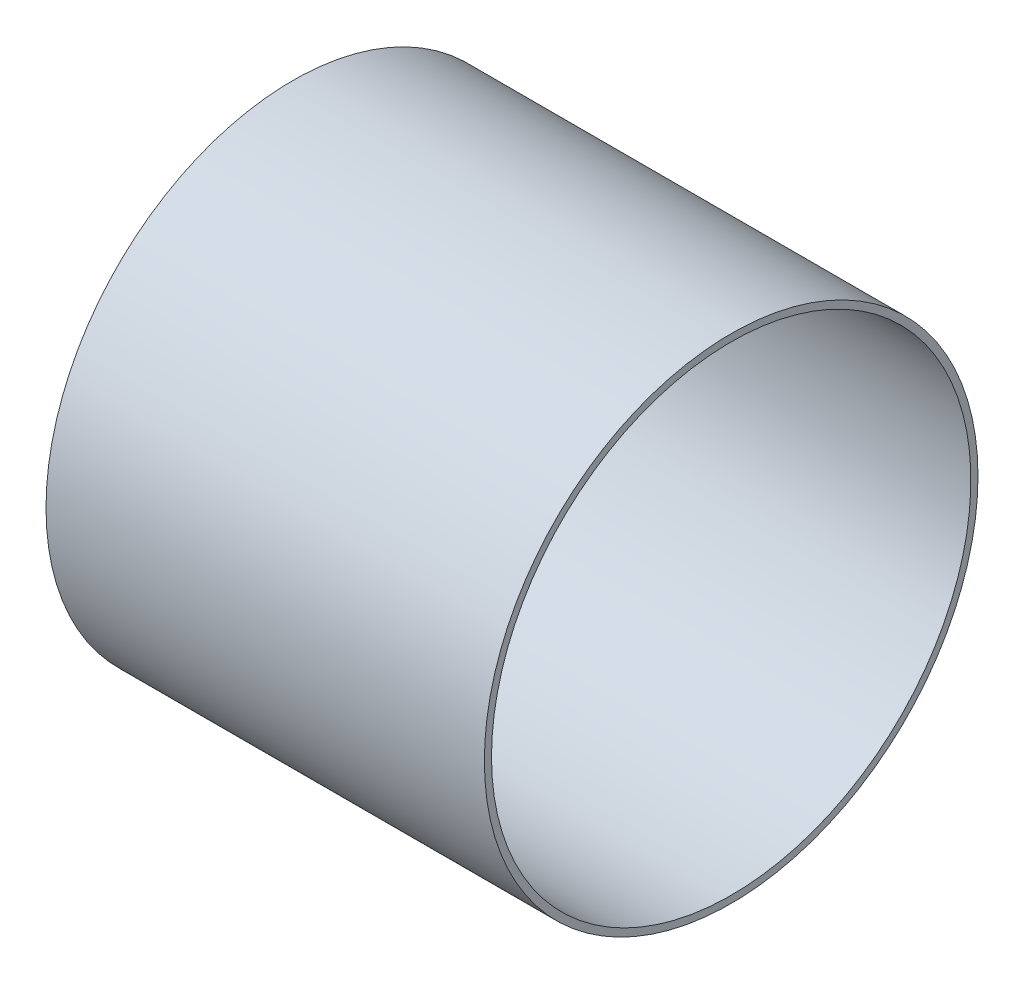
ISO-10303-21;
HEADER;
FILE_DESCRIPTION(('STEP AP214'),'2;1');
FILE_NAME('part.step','',(''),(''),'','','');
FILE_SCHEMA(('AUTOMOTIVE_DESIGN { 1 0 10303 214 1 1 1 1 }'));
ENDSEC;
DATA;
#1=APPLICATION_CONTEXT('core data for automotive mechanical design processes');
#2=APPLICATION_PROTOCOL_DEFINITION('international standard','automotive_design',2000,#1);
#3=PRODUCT_CONTEXT('',#1,'mechanical');
#4=PRODUCT('Part','Part','',(#3));
#5=PRODUCT_RELATED_PRODUCT_CATEGORY('part','',(#4));
#6=PRODUCT_DEFINITION_FORMATION('','',#4);
#7=PRODUCT_DEFINITION_CONTEXT('part definition',#1,'design');
#8=PRODUCT_DEFINITION('design','',#6,#7);
#9=PRODUCT_DEFINITION_SHAPE('','',#8);
#10=(LENGTH_UNIT() NAMED_UNIT(*) SI_UNIT(.MILLI.,.METRE.));
#11=(NAMED_UNIT(*) PLANE_ANGLE_UNIT() SI_UNIT($,.RADIAN.));
#12=(NAMED_UNIT(*) SI_UNIT($,.STERADIAN.) SOLID_ANGLE_UNIT());
#13=UNCERTAINTY_MEASURE_WITH_UNIT(LENGTH_MEASURE(1.E-05),#10,'distance_accuracy_value','');
#14=(GEOMETRIC_REPRESENTATION_CONTEXT(3) GLOBAL_UNCERTAINTY_ASSIGNED_CONTEXT((#13)) GLOBAL_UNIT_ASSIGNED_CONTEXT((#10,
#11,#12)) REPRESENTATION_CONTEXT('',''));
#15=CARTESIAN_POINT('',(0.,0.,0.));
#16=DIRECTION('',(0.,0.,1.));
#17=DIRECTION('',(1.,0.,0.));
#18=AXIS2_PLACEMENT_3D('',#15,#16,#17);
#19=CARTESIAN_POINT('',(101.50094,0.,0.));
#20=DIRECTION('',(1.,0.,0.));
#21=DIRECTION('',(0.,0.,-1.));
#22=AXIS2_PLACEMENT_3D('',#19,#20,#21);
#23=PLANE('',#22);
#24=CARTESIAN_POINT('',(101.50094,0.,0.));
#25=DIRECTION('',(1.,0.,0.));
#26=DIRECTION('',(0.,0.,-1.));
#27=AXIS2_PLACEMENT_3D('',#24,#25,#26);
#28=CIRCLE('',#27,57.15);
#29=CARTESIAN_POINT('',(101.50094,0.,57.15));
#30=VERTEX_POINT('',#29);
#31=EDGE_CURVE('E10',#30,#30,#28,.T.);
#32=ORIENTED_EDGE('',*,*,#31,.T.);
#33=EDGE_LOOP('',(#32));
#34=FACE_BOUND('',#33,.T.);
#35=CARTESIAN_POINT('',(101.50094,0.,0.));
#36=DIRECTION('',(1.,0.,0.));
#37=DIRECTION('',(0.,0.,-1.));
#38=AXIS2_PLACEMENT_3D('',#35,#36,#37);
#39=CIRCLE('',#38,55.499);
#40=CARTESIAN_POINT('',(101.50094,0.,55.499));
#41=VERTEX_POINT('',#40);
#42=EDGE_CURVE('E54',#41,#41,#39,.T.);
#43=ORIENTED_EDGE('',*,*,#42,.F.);
#44=EDGE_LOOP('',(#43));
#45=FACE_BOUND('',#44,.T.);
#46=ADVANCED_FACE('F41',(#34,#45),#23,.T.);
#47=CARTESIAN_POINT('',(0.,0.,0.));
#48=DIRECTION('',(1.,0.,0.));
#49=DIRECTION('',(0.,0.,-1.));
#50=AXIS2_PLACEMENT_3D('',#47,#48,#49);
#51=PLANE('',#50);
#52=CARTESIAN_POINT('',(0.,0.,0.));
#53=DIRECTION('',(1.,0.,0.));
#54=DIRECTION('',(0.,0.,-1.));
#55=AXIS2_PLACEMENT_3D('',#52,#53,#54);
#56=CIRCLE('',#55,57.15);
#57=CARTESIAN_POINT('',(0.,0.,57.15));
#58=VERTEX_POINT('',#57);
#59=EDGE_CURVE('E45',#58,#58,#56,.T.);
#60=ORIENTED_EDGE('',*,*,#59,.F.);
#61=EDGE_LOOP('',(#60));
#62=FACE_BOUND('',#61,.T.);
#63=CARTESIAN_POINT('',(0.,0.,0.));
#64=DIRECTION('',(1.,0.,0.));
#65=DIRECTION('',(0.,0.,-1.));
#66=AXIS2_PLACEMENT_3D('',#63,#64,#65);
#67=CIRCLE('',#66,55.499);
#68=CARTESIAN_POINT('',(0.,0.,55.499));
#69=VERTEX_POINT('',#68);
#70=EDGE_CURVE('E56',#69,#69,#67,.T.);
#71=ORIENTED_EDGE('',*,*,#70,.T.);
#72=EDGE_LOOP('',(#71));
#73=FACE_BOUND('',#72,.T.);
#74=ADVANCED_FACE('F68',(#62,#73),#51,.F.);
#75=CARTESIAN_POINT('',(101.50094,0.,0.));
#76=DIRECTION('',(-1.,0.,0.));
#77=DIRECTION('',(0.,0.,1.));
#78=AXIS2_PLACEMENT_3D('',#75,#76,#77);
#79=CYLINDRICAL_SURFACE('',#78,57.15);
#80=CARTESIAN_POINT('',(101.50094,0.,57.15));
#81=CARTESIAN_POINT('',(100.443638541667,0.,57.15));
#82=CARTESIAN_POINT('',(99.3863370833333,0.,57.15));
#83=CARTESIAN_POINT('',(97.2717341666667,0.,57.15));
#84=CARTESIAN_POINT('',(96.2144327083333,0.,57.15));
#85=CARTESIAN_POINT('',(94.0998297916667,0.,57.15));
#86=CARTESIAN_POINT('',(93.0425283333333,0.,57.15));
#87=CARTESIAN_POINT('',(90.9279254166667,0.,57.15));
#88=CARTESIAN_POINT('',(89.8706239583333,0.,57.15));
#89=CARTESIAN_POINT('',(87.7560210416667,0.,57.15));
#90=CARTESIAN_POINT('',(86.6987195833333,0.,57.15));
#91=CARTESIAN_POINT('',(84.5841166666667,0.,57.15));
#92=CARTESIAN_POINT('',(83.5268152083333,0.,57.15));
#93=CARTESIAN_POINT('',(81.4122122916667,0.,57.15));
#94=CARTESIAN_POINT('',(80.3549108333333,0.,57.15));
#95=CARTESIAN_POINT('',(78.2403079166667,0.,57.15));
#96=CARTESIAN_POINT('',(77.1830064583333,0.,57.15));
#97=CARTESIAN_POINT('',(75.0684035416667,0.,57.15));
#98=CARTESIAN_POINT('',(74.0111020833333,0.,57.15));
#99=CARTESIAN_POINT('',(71.8964991666667,0.,57.15));
#100=CARTESIAN_POINT('',(70.8391977083333,0.,57.15));
#101=CARTESIAN_POINT('',(68.7245947916667,0.,57.15));
#102=CARTESIAN_POINT('',(67.6672933333333,0.,57.15));
#103=CARTESIAN_POINT('',(65.5526904166666,0.,57.15));
#104=CARTESIAN_POINT('',(64.4953889583333,0.,57.15));
#105=CARTESIAN_POINT('',(62.3807860416667,0.,57.15));
#106=CARTESIAN_POINT('',(61.3234845833333,0.,57.15));
#107=CARTESIAN_POINT('',(59.2088816666667,0.,57.15));
#108=CARTESIAN_POINT('',(58.1515802083333,0.,57.15));
#109=CARTESIAN_POINT('',(56.0369772916667,0.,57.15));
#110=CARTESIAN_POINT('',(54.9796758333333,0.,57.15));
#111=CARTESIAN_POINT('',(52.8650729166667,0.,57.15));
#112=CARTESIAN_POINT('',(51.8077714583333,0.,57.15));
#113=CARTESIAN_POINT('',(49.6931685416667,0.,57.15));
#114=CARTESIAN_POINT('',(48.6358670833333,0.,57.15));
#115=CARTESIAN_POINT('',(46.5212641666667,0.,57.15));
#116=CARTESIAN_POINT('',(45.4639627083333,0.,57.15));
#117=CARTESIAN_POINT('',(43.3493597916667,0.,57.15));
#118=CARTESIAN_POINT('',(42.2920583333333,0.,57.15));
#119=CARTESIAN_POINT('',(40.1774554166667,0.,57.15));
#120=CARTESIAN_POINT('',(39.1201539583333,0.,57.15));
#121=CARTESIAN_POINT('',(37.0055510416667,0.,57.15));
#122=CARTESIAN_POINT('',(35.9482495833333,0.,57.15));
#123=CARTESIAN_POINT('',(33.8336466666667,0.,57.15));
#124=CARTESIAN_POINT('',(32.7763452083333,0.,57.15));
#125=CARTESIAN_POINT('',(30.6617422916667,0.,57.15));
#126=CARTESIAN_POINT('',(29.6044408333333,0.,57.15));
#127=CARTESIAN_POINT('',(27.4898379166667,0.,57.15));
#128=CARTESIAN_POINT('',(26.4325364583333,0.,57.15));
#129=CARTESIAN_POINT('',(24.3179335416667,0.,57.15));
#130=CARTESIAN_POINT('',(23.2606320833333,0.,57.15));
#131=CARTESIAN_POINT('',(21.1460291666667,0.,57.15));
#132=CARTESIAN_POINT('',(20.0887277083333,0.,57.15));
#133=CARTESIAN_POINT('',(17.9741247916667,0.,57.15));
#134=CARTESIAN_POINT('',(16.9168233333333,0.,57.15));
#135=CARTESIAN_POINT('',(14.8022204166667,0.,57.15));
#136=CARTESIAN_POINT('',(13.7449189583333,0.,57.15));
#137=CARTESIAN_POINT('',(11.6303160416667,0.,57.15));
#138=CARTESIAN_POINT('',(10.5730145833333,0.,57.15));
#139=CARTESIAN_POINT('',(8.45841166666667,0.,57.15));
#140=CARTESIAN_POINT('',(7.40111020833333,0.,57.15));
#141=CARTESIAN_POINT('',(5.28650729166667,0.,57.15));
#142=CARTESIAN_POINT('',(4.22920583333334,0.,57.15));
#143=CARTESIAN_POINT('',(2.11460291666667,0.,57.15));
#144=CARTESIAN_POINT('',(1.05730145833334,0.,57.15));
#145=CARTESIAN_POINT('',(0.,0.,57.15));
#146=B_SPLINE_CURVE_WITH_KNOTS('',3,(#80,#81,#82,#83,#84,#85,#86,#87,#88,#89,#90,#91,#92,#93,
#94,#95,#96,#97,#98,#99,#100,#101,#102,#103,#104,#105,#106,#107,#108,#109,#110,#111,#112,#113,
#114,#115,#116,#117,#118,#119,#120,#121,#122,#123,#124,#125,#126,#127,#128,#129,#130,#131,#132,
#133,#134,#135,#136,#137,#138,#139,#140,#141,#142,#143,#144,#145),.UNSPECIFIED.,.F.,.F.,(4,2,2,
2,2,2,2,2,2,2,2,2,2,2,2,2,2,2,2,2,2,2,2,2,2,2,2,2,2,2,2,2,4),(0.,3.17190437499999,
6.34380874999998,9.51571312499999,12.6876175,15.859521875,19.03142625,22.203330625,25.375235,
28.547139375,31.71904375,34.890948125,38.0628525,41.234756875,44.40666125,47.578565625,50.75047,
53.922374375,57.09427875,60.266183125,63.4380875,66.609991875,69.78189625,72.953800625,
76.125705,79.297609375,82.46951375,85.641418125,88.8133225,91.985226875,95.15713125,
98.329035625,101.50094),.UNSPECIFIED.);
#147=EDGE_CURVE('BSEAM43',#30,#58,#146,.T.);
#148=ORIENTED_EDGE('',*,*,#31,.F.);
#149=ORIENTED_EDGE('',*,*,#59,.T.);
#150=ORIENTED_EDGE('',*,*,#147,.T.);
#151=ORIENTED_EDGE('',*,*,#147,.F.);
#152=EDGE_LOOP('',(#148,#150,#149,#151));
#153=FACE_BOUND('',#152,.T.);
#154=ADVANCED_FACE('F43',(#153),#79,.T.);
#155=CARTESIAN_POINT('',(101.50094,0.,0.));
#156=DIRECTION('',(-1.,0.,0.));
#157=DIRECTION('',(0.,0.,1.));
#158=AXIS2_PLACEMENT_3D('',#155,#156,#157);
#159=CYLINDRICAL_SURFACE('',#158,55.499);
#160=CARTESIAN_POINT('',(101.50094,0.,55.499));
#161=CARTESIAN_POINT('',(100.443638541667,0.,55.499));
#162=CARTESIAN_POINT('',(99.3863370833333,0.,55.499));
#163=CARTESIAN_POINT('',(97.2717341666667,0.,55.499));
#164=CARTESIAN_POINT('',(96.2144327083333,0.,55.499));
#165=CARTESIAN_POINT('',(94.0998297916667,0.,55.499));
#166=CARTESIAN_POINT('',(93.0425283333333,0.,55.499));
#167=CARTESIAN_POINT('',(90.9279254166667,0.,55.499));
#168=CARTESIAN_POINT('',(89.8706239583333,0.,55.499));
#169=CARTESIAN_POINT('',(87.7560210416667,0.,55.499));
#170=CARTESIAN_POINT('',(86.6987195833333,0.,55.499));
#171=CARTESIAN_POINT('',(84.5841166666667,0.,55.499));
#172=CARTESIAN_POINT('',(83.5268152083333,0.,55.499));
#173=CARTESIAN_POINT('',(81.4122122916667,0.,55.499));
#174=CARTESIAN_POINT('',(80.3549108333333,0.,55.499));
#175=CARTESIAN_POINT('',(78.2403079166667,0.,55.499));
#176=CARTESIAN_POINT('',(77.1830064583333,0.,55.499));
#177=CARTESIAN_POINT('',(75.0684035416667,0.,55.499));
#178=CARTESIAN_POINT('',(74.0111020833333,0.,55.499));
#179=CARTESIAN_POINT('',(71.8964991666667,0.,55.499));
#180=CARTESIAN_POINT('',(70.8391977083333,0.,55.499));
#181=CARTESIAN_POINT('',(68.7245947916667,0.,55.499));
#182=CARTESIAN_POINT('',(67.6672933333333,0.,55.499));
#183=CARTESIAN_POINT('',(65.5526904166666,0.,55.499));
#184=CARTESIAN_POINT('',(64.4953889583333,0.,55.499));
#185=CARTESIAN_POINT('',(62.3807860416667,0.,55.499));
#186=CARTESIAN_POINT('',(61.3234845833333,0.,55.499));
#187=CARTESIAN_POINT('',(59.2088816666667,0.,55.499));
#188=CARTESIAN_POINT('',(58.1515802083333,0.,55.499));
#189=CARTESIAN_POINT('',(56.0369772916667,0.,55.499));
#190=CARTESIAN_POINT('',(54.9796758333333,0.,55.499));
#191=CARTESIAN_POINT('',(52.8650729166667,0.,55.499));
#192=CARTESIAN_POINT('',(51.8077714583333,0.,55.499));
#193=CARTESIAN_POINT('',(49.6931685416667,0.,55.499));
#194=CARTESIAN_POINT('',(48.6358670833333,0.,55.499));
#195=CARTESIAN_POINT('',(46.5212641666667,0.,55.499));
#196=CARTESIAN_POINT('',(45.4639627083333,0.,55.499));
#197=CARTESIAN_POINT('',(43.3493597916667,0.,55.499));
#198=CARTESIAN_POINT('',(42.2920583333333,0.,55.499));
#199=CARTESIAN_POINT('',(40.1774554166667,0.,55.499));
#200=CARTESIAN_POINT('',(39.1201539583333,0.,55.499));
#201=CARTESIAN_POINT('',(37.0055510416667,0.,55.499));
#202=CARTESIAN_POINT('',(35.9482495833333,0.,55.499));
#203=CARTESIAN_POINT('',(33.8336466666667,0.,55.499));
#204=CARTESIAN_POINT('',(32.7763452083333,0.,55.499));
#205=CARTESIAN_POINT('',(30.6617422916667,0.,55.499));
#206=CARTESIAN_POINT('',(29.6044408333333,0.,55.499));
#207=CARTESIAN_POINT('',(27.4898379166667,0.,55.499));
#208=CARTESIAN_POINT('',(26.4325364583333,0.,55.499));
#209=CARTESIAN_POINT('',(24.3179335416667,0.,55.499));
#210=CARTESIAN_POINT('',(23.2606320833333,0.,55.499));
#211=CARTESIAN_POINT('',(21.1460291666667,0.,55.499));
#212=CARTESIAN_POINT('',(20.0887277083333,0.,55.499));
#213=CARTESIAN_POINT('',(17.9741247916667,0.,55.499));
#214=CARTESIAN_POINT('',(16.9168233333333,0.,55.499));
#215=CARTESIAN_POINT('',(14.8022204166667,0.,55.499));
#216=CARTESIAN_POINT('',(13.7449189583333,0.,55.499));
#217=CARTESIAN_POINT('',(11.6303160416667,0.,55.499));
#218=CARTESIAN_POINT('',(10.5730145833333,0.,55.499));
#219=CARTESIAN_POINT('',(8.45841166666667,0.,55.499));
#220=CARTESIAN_POINT('',(7.40111020833333,0.,55.499));
#221=CARTESIAN_POINT('',(5.28650729166667,0.,55.499));
#222=CARTESIAN_POINT('',(4.22920583333334,0.,55.499));
#223=CARTESIAN_POINT('',(2.11460291666667,0.,55.499));
#224=CARTESIAN_POINT('',(1.05730145833334,0.,55.499));
#225=CARTESIAN_POINT('',(0.,0.,55.499));
#226=B_SPLINE_CURVE_WITH_KNOTS('',3,(#160,#161,#162,#163,#164,#165,#166,#167,#168,#169,#170,
#171,#172,#173,#174,#175,#176,#177,#178,#179,#180,#181,#182,#183,#184,#185,#186,#187,#188,#189,
#190,#191,#192,#193,#194,#195,#196,#197,#198,#199,#200,#201,#202,#203,#204,#205,#206,#207,#208,
#209,#210,#211,#212,#213,#214,#215,#216,#217,#218,#219,#220,#221,#222,#223,#224,#225),
.UNSPECIFIED.,.F.,.F.,(4,2,2,2,2,2,2,2,2,2,2,2,2,2,2,2,2,2,2,2,2,2,2,2,2,2,2,2,2,2,2,2,4),(0.,
3.17190437499999,6.34380874999998,9.51571312499999,12.6876175,15.859521875,19.03142625,
22.203330625,25.375235,28.547139375,31.71904375,34.890948125,38.0628525,41.234756875,
44.40666125,47.578565625,50.75047,53.922374375,57.09427875,60.266183125,63.4380875,66.609991875,
69.78189625,72.953800625,76.125705,79.297609375,82.46951375,85.641418125,88.8133225,
91.985226875,95.15713125,98.329035625,101.50094),.UNSPECIFIED.);
#227=EDGE_CURVE('BSEAM64',#41,#69,#226,.T.);
#228=ORIENTED_EDGE('',*,*,#42,.T.);
#229=ORIENTED_EDGE('',*,*,#70,.F.);
#230=ORIENTED_EDGE('',*,*,#227,.T.);
#231=ORIENTED_EDGE('',*,*,#227,.F.);
#232=EDGE_LOOP('',(#228,#230,#229,#231));
#233=FACE_BOUND('',#232,.T.);
#234=ADVANCED_FACE('F64',(#233),#159,.F.);
#235=CLOSED_SHELL('',(#46,#74,#154,#234));
#236=MANIFOLD_SOLID_BREP('B2',#235);
#237=ADVANCED_BREP_SHAPE_REPRESENTATION('',(#18,#236),#14);
#238=SHAPE_DEFINITION_REPRESENTATION(#9,#237);
ENDSEC;
END-ISO-10303-21;
